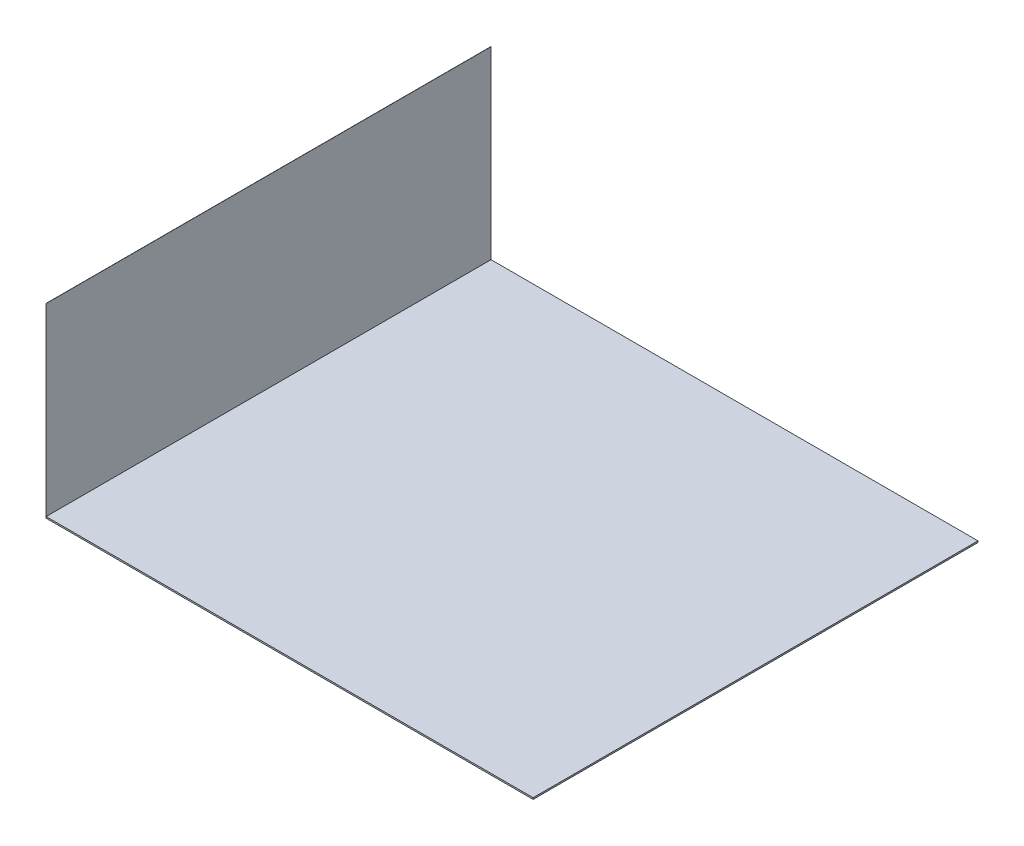
ISO-10303-21;
HEADER;
FILE_DESCRIPTION(('STEP AP214'),'2;1');
FILE_NAME('part.step','',(''),(''),'','','');
FILE_SCHEMA(('AUTOMOTIVE_DESIGN { 1 0 10303 214 1 1 1 1 }'));
ENDSEC;
DATA;
#1=APPLICATION_CONTEXT('core data for automotive mechanical design processes');
#2=APPLICATION_PROTOCOL_DEFINITION('international standard','automotive_design',2000,#1);
#3=PRODUCT_CONTEXT('',#1,'mechanical');
#4=PRODUCT('Part','Part','',(#3));
#5=PRODUCT_RELATED_PRODUCT_CATEGORY('part','',(#4));
#6=PRODUCT_DEFINITION_FORMATION('','',#4);
#7=PRODUCT_DEFINITION_CONTEXT('part definition',#1,'design');
#8=PRODUCT_DEFINITION('design','',#6,#7);
#9=PRODUCT_DEFINITION_SHAPE('','',#8);
#10=(LENGTH_UNIT() NAMED_UNIT(*) SI_UNIT(.MILLI.,.METRE.));
#11=(NAMED_UNIT(*) PLANE_ANGLE_UNIT() SI_UNIT($,.RADIAN.));
#12=(NAMED_UNIT(*) SI_UNIT($,.STERADIAN.) SOLID_ANGLE_UNIT());
#13=UNCERTAINTY_MEASURE_WITH_UNIT(LENGTH_MEASURE(1.E-05),#10,'distance_accuracy_value','');
#14=(GEOMETRIC_REPRESENTATION_CONTEXT(3) GLOBAL_UNCERTAINTY_ASSIGNED_CONTEXT((#13)) GLOBAL_UNIT_ASSIGNED_CONTEXT((#10,
#11,#12)) REPRESENTATION_CONTEXT('',''));
#15=CARTESIAN_POINT('',(0.,0.,0.));
#16=DIRECTION('',(0.,0.,1.));
#17=DIRECTION('',(1.,0.,0.));
#18=AXIS2_PLACEMENT_3D('',#15,#16,#17);
#19=CARTESIAN_POINT('',(-2.54,0.,0.));
#20=DIRECTION('',(0.,0.,1.));
#21=DIRECTION('',(1.,0.,0.));
#22=AXIS2_PLACEMENT_3D('',#19,#20,#21);
#23=PLANE('',#22);
#24=DIRECTION('',(0.,-1.,0.));
#25=VECTOR('',#24,1.);
#26=CARTESIAN_POINT('',(0.,0.,0.));
#27=LINE('',#26,#25);
#28=CARTESIAN_POINT('',(0.,3117.85,0.));
#29=VERTEX_POINT('',#28);
#30=CARTESIAN_POINT('',(0.,0.,0.));
#31=VERTEX_POINT('',#30);
#32=EDGE_CURVE('E105',#29,#31,#27,.T.);
#33=ORIENTED_EDGE('',*,*,#32,.F.);
#34=DIRECTION('',(1.,0.,0.));
#35=VECTOR('',#34,1.);
#36=CARTESIAN_POINT('',(-2.54,3117.85,0.));
#37=LINE('',#36,#35);
#38=CARTESIAN_POINT('',(-2.54,3117.85,0.));
#39=VERTEX_POINT('',#38);
#40=EDGE_CURVE('E12',#39,#29,#37,.T.);
#41=ORIENTED_EDGE('',*,*,#40,.F.);
#42=DIRECTION('',(0.,-1.,0.));
#43=VECTOR('',#42,1.);
#44=CARTESIAN_POINT('',(-2.54,0.,0.));
#45=LINE('',#44,#43);
#46=CARTESIAN_POINT('',(-2.54,0.,0.));
#47=VERTEX_POINT('',#46);
#48=EDGE_CURVE('E99',#39,#47,#45,.T.);
#49=ORIENTED_EDGE('',*,*,#48,.T.);
#50=DIRECTION('',(1.,0.,0.));
#51=VECTOR('',#50,1.);
#52=CARTESIAN_POINT('',(-2.54,0.,0.));
#53=LINE('',#52,#51);
#54=EDGE_CURVE('E44',#47,#31,#53,.T.);
#55=ORIENTED_EDGE('',*,*,#54,.T.);
#56=EDGE_LOOP('',(#33,#41,#49,#55));
#57=FACE_BOUND('',#56,.T.);
#58=ADVANCED_FACE('F41',(#57),#23,.T.);
#59=CARTESIAN_POINT('',(-2.54,3117.85,0.));
#60=DIRECTION('',(0.,1.,0.));
#61=DIRECTION('',(0.,0.,1.));
#62=AXIS2_PLACEMENT_3D('',#59,#60,#61);
#63=PLANE('',#62);
#64=DIRECTION('',(0.,0.,1.));
#65=VECTOR('',#64,1.);
#66=CARTESIAN_POINT('',(0.,3117.85,0.));
#67=LINE('',#66,#65);
#68=CARTESIAN_POINT('',(0.,3117.85,-7518.4));
#69=VERTEX_POINT('',#68);
#70=EDGE_CURVE('E101',#69,#29,#67,.T.);
#71=ORIENTED_EDGE('',*,*,#70,.F.);
#72=DIRECTION('',(1.,0.,0.));
#73=VECTOR('',#72,1.);
#74=CARTESIAN_POINT('',(-2.54,3117.85,-7518.4));
#75=LINE('',#74,#73);
#76=CARTESIAN_POINT('',(-2.54,3117.85,-7518.4));
#77=VERTEX_POINT('',#76);
#78=EDGE_CURVE('E50',#77,#69,#75,.T.);
#79=ORIENTED_EDGE('',*,*,#78,.F.);
#80=DIRECTION('',(0.,0.,1.));
#81=VECTOR('',#80,1.);
#82=CARTESIAN_POINT('',(-2.54,3117.85,0.));
#83=LINE('',#82,#81);
#84=EDGE_CURVE('E96',#77,#39,#83,.T.);
#85=ORIENTED_EDGE('',*,*,#84,.T.);
#86=ORIENTED_EDGE('',*,*,#40,.T.);
#87=EDGE_LOOP('',(#71,#79,#85,#86));
#88=FACE_BOUND('',#87,.T.);
#89=ADVANCED_FACE('F115',(#88),#63,.T.);
#90=CARTESIAN_POINT('',(-2.54,0.,-7518.4));
#91=DIRECTION('',(0.,0.,-1.));
#92=DIRECTION('',(-1.,0.,0.));
#93=AXIS2_PLACEMENT_3D('',#90,#91,#92);
#94=PLANE('',#93);
#95=DIRECTION('',(0.,1.,0.));
#96=VECTOR('',#95,1.);
#97=CARTESIAN_POINT('',(0.,0.,-7518.4));
#98=LINE('',#97,#96);
#99=CARTESIAN_POINT('',(0.,0.,-7518.4));
#100=VERTEX_POINT('',#99);
#101=EDGE_CURVE('E91',#100,#69,#98,.T.);
#102=ORIENTED_EDGE('',*,*,#101,.F.);
#103=DIRECTION('',(1.,0.,0.));
#104=VECTOR('',#103,1.);
#105=CARTESIAN_POINT('',(-2.54,0.,-7518.4));
#106=LINE('',#105,#104);
#107=CARTESIAN_POINT('',(-2.54,0.,-7518.4));
#108=VERTEX_POINT('',#107);
#109=EDGE_CURVE('E86',#108,#100,#106,.T.);
#110=ORIENTED_EDGE('',*,*,#109,.F.);
#111=DIRECTION('',(0.,1.,0.));
#112=VECTOR('',#111,1.);
#113=CARTESIAN_POINT('',(-2.54,0.,-7518.4));
#114=LINE('',#113,#112);
#115=EDGE_CURVE('E89',#108,#77,#114,.T.);
#116=ORIENTED_EDGE('',*,*,#115,.T.);
#117=ORIENTED_EDGE('',*,*,#78,.T.);
#118=EDGE_LOOP('',(#102,#110,#116,#117));
#119=FACE_BOUND('',#118,.T.);
#120=ADVANCED_FACE('F88',(#119),#94,.T.);
#121=CARTESIAN_POINT('',(-2.54,0.,0.));
#122=DIRECTION('',(0.,-1.,0.));
#123=DIRECTION('',(0.,0.,-1.));
#124=AXIS2_PLACEMENT_3D('',#121,#122,#123);
#125=PLANE('',#124);
#126=DIRECTION('',(0.,0.,-1.));
#127=VECTOR('',#126,1.);
#128=CARTESIAN_POINT('',(0.,0.,0.));
#129=LINE('',#128,#127);
#130=EDGE_CURVE('E108',#31,#100,#129,.T.);
#131=ORIENTED_EDGE('',*,*,#130,.F.);
#132=ORIENTED_EDGE('',*,*,#54,.F.);
#133=DIRECTION('',(0.,0.,-1.));
#134=VECTOR('',#133,1.);
#135=CARTESIAN_POINT('',(-2.54,0.,0.));
#136=LINE('',#135,#134);
#137=EDGE_CURVE('E95',#47,#108,#136,.T.);
#138=ORIENTED_EDGE('',*,*,#137,.T.);
#139=ORIENTED_EDGE('',*,*,#109,.T.);
#140=EDGE_LOOP('',(#131,#132,#138,#139));
#141=FACE_BOUND('',#140,.T.);
#142=ADVANCED_FACE('F98',(#141),#125,.T.);
#143=CARTESIAN_POINT('',(-2.54,3117.85,0.));
#144=DIRECTION('',(-1.,0.,0.));
#145=DIRECTION('',(0.,0.,1.));
#146=AXIS2_PLACEMENT_3D('',#143,#144,#145);
#147=PLANE('',#146);
#148=ORIENTED_EDGE('',*,*,#48,.F.);
#149=ORIENTED_EDGE('',*,*,#84,.F.);
#150=ORIENTED_EDGE('',*,*,#115,.F.);
#151=ORIENTED_EDGE('',*,*,#137,.F.);
#152=EDGE_LOOP('',(#148,#149,#150,#151));
#153=FACE_BOUND('',#152,.T.);
#154=ADVANCED_FACE('F94',(#153),#147,.T.);
#155=CARTESIAN_POINT('',(0.,3117.85,0.));
#156=DIRECTION('',(-1.,0.,0.));
#157=DIRECTION('',(0.,0.,1.));
#158=AXIS2_PLACEMENT_3D('',#155,#156,#157);
#159=PLANE('',#158);
#160=ORIENTED_EDGE('',*,*,#32,.T.);
#161=ORIENTED_EDGE('',*,*,#130,.T.);
#162=ORIENTED_EDGE('',*,*,#101,.T.);
#163=ORIENTED_EDGE('',*,*,#70,.T.);
#164=EDGE_LOOP('',(#160,#161,#162,#163));
#165=FACE_BOUND('',#164,.T.);
#166=ADVANCED_FACE('F114',(#165),#159,.F.);
#167=CLOSED_SHELL('',(#58,#89,#120,#142,#154,#166));
#168=MANIFOLD_SOLID_BREP('B2',#167);
#169=CARTESIAN_POINT('',(8229.6,0.,0.));
#170=DIRECTION('',(0.,0.,-1.));
#171=DIRECTION('',(0.,1.,0.));
#172=AXIS2_PLACEMENT_3D('',#169,#170,#171);
#173=PLANE('',#172);
#174=DIRECTION('',(0.,-1.,0.));
#175=VECTOR('',#174,1.);
#176=CARTESIAN_POINT('',(0.,0.,0.));
#177=LINE('',#176,#175);
#178=CARTESIAN_POINT('',(0.,0.,0.));
#179=VERTEX_POINT('',#178);
#180=CARTESIAN_POINT('',(0.,-25.4,0.));
#181=VERTEX_POINT('',#180);
#182=EDGE_CURVE('E230',#179,#181,#177,.T.);
#183=ORIENTED_EDGE('',*,*,#182,.T.);
#184=DIRECTION('',(-1.,0.,0.));
#185=VECTOR('',#184,1.);
#186=CARTESIAN_POINT('',(8229.6,-25.4,0.));
#187=LINE('',#186,#185);
#188=CARTESIAN_POINT('',(8229.6,-25.4,0.));
#189=VERTEX_POINT('',#188);
#190=EDGE_CURVE('E39',#189,#181,#187,.T.);
#191=ORIENTED_EDGE('',*,*,#190,.F.);
#192=DIRECTION('',(0.,-1.,0.));
#193=VECTOR('',#192,1.);
#194=CARTESIAN_POINT('',(8229.6,0.,0.));
#195=LINE('',#194,#193);
#196=CARTESIAN_POINT('',(8229.6,0.,0.));
#197=VERTEX_POINT('',#196);
#198=EDGE_CURVE('E216',#197,#189,#195,.T.);
#199=ORIENTED_EDGE('',*,*,#198,.F.);
#200=DIRECTION('',(-1.,0.,0.));
#201=VECTOR('',#200,1.);
#202=CARTESIAN_POINT('',(8229.6,0.,0.));
#203=LINE('',#202,#201);
#204=EDGE_CURVE('E206',#197,#179,#203,.T.);
#205=ORIENTED_EDGE('',*,*,#204,.T.);
#206=EDGE_LOOP('',(#183,#191,#199,#205));
#207=FACE_BOUND('',#206,.T.);
#208=ADVANCED_FACE('F165',(#207),#173,.F.);
#209=CARTESIAN_POINT('',(8229.6,-25.4,0.));
#210=DIRECTION('',(0.,1.,0.));
#211=DIRECTION('',(0.,0.,1.));
#212=AXIS2_PLACEMENT_3D('',#209,#210,#211);
#213=PLANE('',#212);
#214=DIRECTION('',(0.,0.,-1.));
#215=VECTOR('',#214,1.);
#216=CARTESIAN_POINT('',(0.,-25.4,0.));
#217=LINE('',#216,#215);
#218=CARTESIAN_POINT('',(0.,-25.4,-7518.4));
#219=VERTEX_POINT('',#218);
#220=EDGE_CURVE('E221',#181,#219,#217,.T.);
#221=ORIENTED_EDGE('',*,*,#220,.T.);
#222=DIRECTION('',(-1.,0.,0.));
#223=VECTOR('',#222,1.);
#224=CARTESIAN_POINT('',(8229.6,-25.4,-7518.4));
#225=LINE('',#224,#223);
#226=CARTESIAN_POINT('',(8229.6,-25.4,-7518.4));
#227=VERTEX_POINT('',#226);
#228=EDGE_CURVE('E173',#227,#219,#225,.T.);
#229=ORIENTED_EDGE('',*,*,#228,.F.);
#230=DIRECTION('',(0.,0.,-1.));
#231=VECTOR('',#230,1.);
#232=CARTESIAN_POINT('',(8229.6,-25.4,0.));
#233=LINE('',#232,#231);
#234=EDGE_CURVE('E212',#189,#227,#233,.T.);
#235=ORIENTED_EDGE('',*,*,#234,.F.);
#236=ORIENTED_EDGE('',*,*,#190,.T.);
#237=EDGE_LOOP('',(#221,#229,#235,#236));
#238=FACE_BOUND('',#237,.T.);
#239=ADVANCED_FACE('F220',(#238),#213,.F.);
#240=CARTESIAN_POINT('',(8229.6,9.33180860950283E-13,-7518.4));
#241=DIRECTION('',(0.,0.,-1.));
#242=DIRECTION('',(-1.,0.,0.));
#243=AXIS2_PLACEMENT_3D('',#240,#241,#242);
#244=PLANE('',#243);
#245=DIRECTION('',(0.,-1.,0.));
#246=VECTOR('',#245,1.);
#247=CARTESIAN_POINT('',(0.,9.33180860950283E-13,-7518.4));
#248=LINE('',#247,#246);
#249=CARTESIAN_POINT('',(0.,9.33180860950283E-13,-7518.4));
#250=VERTEX_POINT('',#249);
#251=EDGE_CURVE('E233',#250,#219,#248,.T.);
#252=ORIENTED_EDGE('',*,*,#251,.F.);
#253=DIRECTION('',(-1.,0.,0.));
#254=VECTOR('',#253,1.);
#255=CARTESIAN_POINT('',(8229.6,9.33180860950283E-13,-7518.4));
#256=LINE('',#255,#254);
#257=CARTESIAN_POINT('',(8229.6,9.33180860950283E-13,-7518.4));
#258=VERTEX_POINT('',#257);
#259=EDGE_CURVE('E224',#258,#250,#256,.T.);
#260=ORIENTED_EDGE('',*,*,#259,.F.);
#261=DIRECTION('',(0.,-1.,0.));
#262=VECTOR('',#261,1.);
#263=CARTESIAN_POINT('',(8229.6,9.33180860950283E-13,-7518.4));
#264=LINE('',#263,#262);
#265=EDGE_CURVE('E215',#258,#227,#264,.T.);
#266=ORIENTED_EDGE('',*,*,#265,.T.);
#267=ORIENTED_EDGE('',*,*,#228,.T.);
#268=EDGE_LOOP('',(#252,#260,#266,#267));
#269=FACE_BOUND('',#268,.T.);
#270=ADVANCED_FACE('F225',(#269),#244,.T.);
#271=CARTESIAN_POINT('',(8229.6,0.,0.));
#272=DIRECTION('',(0.,1.,0.));
#273=DIRECTION('',(0.,0.,1.));
#274=AXIS2_PLACEMENT_3D('',#271,#272,#273);
#275=PLANE('',#274);
#276=DIRECTION('',(0.,0.,-1.));
#277=VECTOR('',#276,1.);
#278=CARTESIAN_POINT('',(0.,0.,0.));
#279=LINE('',#278,#277);
#280=EDGE_CURVE('E199',#179,#250,#279,.T.);
#281=ORIENTED_EDGE('',*,*,#280,.F.);
#282=ORIENTED_EDGE('',*,*,#204,.F.);
#283=DIRECTION('',(0.,0.,1.));
#284=VECTOR('',#283,1.);
#285=CARTESIAN_POINT('',(8229.6,9.33180860950283E-13,-7518.4));
#286=LINE('',#285,#284);
#287=EDGE_CURVE('E181',#258,#197,#286,.T.);
#288=ORIENTED_EDGE('',*,*,#287,.F.);
#289=ORIENTED_EDGE('',*,*,#259,.T.);
#290=EDGE_LOOP('',(#281,#282,#288,#289));
#291=FACE_BOUND('',#290,.T.);
#292=ADVANCED_FACE('F238',(#291),#275,.T.);
#293=CARTESIAN_POINT('',(8229.6,-25.4,0.));
#294=DIRECTION('',(1.,0.,0.));
#295=DIRECTION('',(0.,0.,-1.));
#296=AXIS2_PLACEMENT_3D('',#293,#294,#295);
#297=PLANE('',#296);
#298=ORIENTED_EDGE('',*,*,#198,.T.);
#299=ORIENTED_EDGE('',*,*,#234,.T.);
#300=ORIENTED_EDGE('',*,*,#265,.F.);
#301=ORIENTED_EDGE('',*,*,#287,.T.);
#302=EDGE_LOOP('',(#298,#299,#300,#301));
#303=FACE_BOUND('',#302,.T.);
#304=ADVANCED_FACE('F213',(#303),#297,.T.);
#305=CARTESIAN_POINT('',(0.,-25.4,0.));
#306=DIRECTION('',(1.,0.,0.));
#307=DIRECTION('',(0.,0.,-1.));
#308=AXIS2_PLACEMENT_3D('',#305,#306,#307);
#309=PLANE('',#308);
#310=ORIENTED_EDGE('',*,*,#182,.F.);
#311=ORIENTED_EDGE('',*,*,#280,.T.);
#312=ORIENTED_EDGE('',*,*,#251,.T.);
#313=ORIENTED_EDGE('',*,*,#220,.F.);
#314=EDGE_LOOP('',(#310,#311,#312,#313));
#315=FACE_BOUND('',#314,.T.);
#316=ADVANCED_FACE('F239',(#315),#309,.F.);
#317=CLOSED_SHELL('',(#208,#239,#270,#292,#304,#316));
#318=MANIFOLD_SOLID_BREP('B6',#317);
#319=ADVANCED_BREP_SHAPE_REPRESENTATION('',(#18,#168,#318),#14);
#320=SHAPE_DEFINITION_REPRESENTATION(#9,#319);
ENDSEC;
END-ISO-10303-21;
